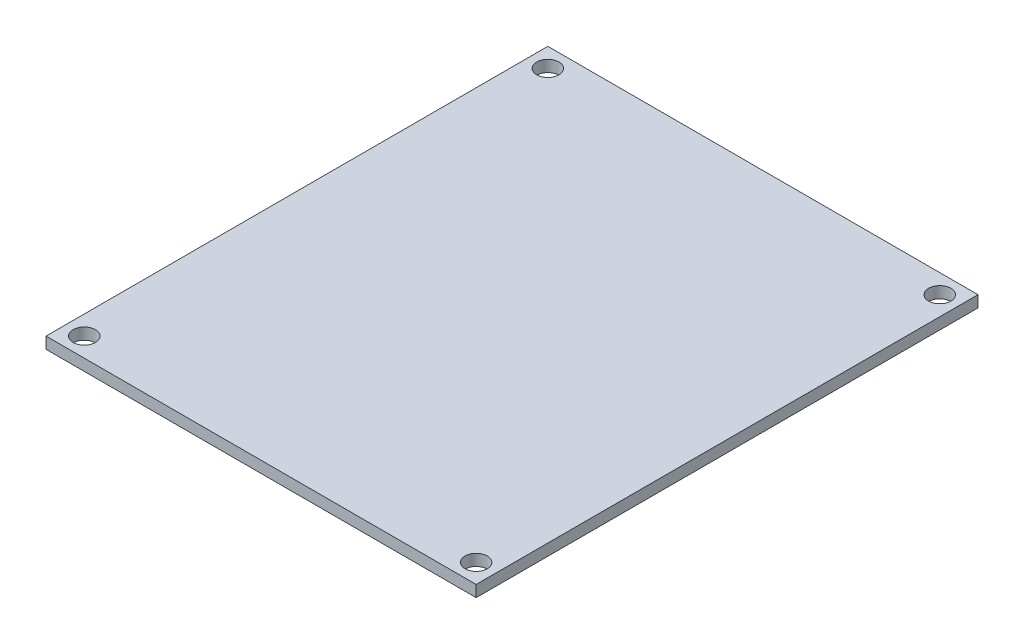
ISO-10303-21;
HEADER;
FILE_DESCRIPTION(('STEP AP214'),'2;1');
FILE_NAME('part.step','',(''),(''),'','','');
FILE_SCHEMA(('AUTOMOTIVE_DESIGN { 1 0 10303 214 1 1 1 1 }'));
ENDSEC;
DATA;
#1=APPLICATION_CONTEXT('core data for automotive mechanical design processes');
#2=APPLICATION_PROTOCOL_DEFINITION('international standard','automotive_design',2000,#1);
#3=PRODUCT_CONTEXT('',#1,'mechanical');
#4=PRODUCT('Part','Part','',(#3));
#5=PRODUCT_RELATED_PRODUCT_CATEGORY('part','',(#4));
#6=PRODUCT_DEFINITION_FORMATION('','',#4);
#7=PRODUCT_DEFINITION_CONTEXT('part definition',#1,'design');
#8=PRODUCT_DEFINITION('design','',#6,#7);
#9=PRODUCT_DEFINITION_SHAPE('','',#8);
#10=(LENGTH_UNIT() NAMED_UNIT(*) SI_UNIT(.MILLI.,.METRE.));
#11=(NAMED_UNIT(*) PLANE_ANGLE_UNIT() SI_UNIT($,.RADIAN.));
#12=(NAMED_UNIT(*) SI_UNIT($,.STERADIAN.) SOLID_ANGLE_UNIT());
#13=UNCERTAINTY_MEASURE_WITH_UNIT(LENGTH_MEASURE(1.E-05),#10,'distance_accuracy_value','');
#14=(GEOMETRIC_REPRESENTATION_CONTEXT(3) GLOBAL_UNCERTAINTY_ASSIGNED_CONTEXT((#13)) GLOBAL_UNIT_ASSIGNED_CONTEXT((#10,
#11,#12)) REPRESENTATION_CONTEXT('',''));
#15=CARTESIAN_POINT('',(0.,0.,0.));
#16=DIRECTION('',(0.,0.,1.));
#17=DIRECTION('',(1.,0.,0.));
#18=AXIS2_PLACEMENT_3D('',#15,#16,#17);
#19=CARTESIAN_POINT('',(30.,1.6,-35.));
#20=DIRECTION('',(-1.,0.,0.));
#21=DIRECTION('',(0.,0.,1.));
#22=AXIS2_PLACEMENT_3D('',#19,#20,#21);
#23=PLANE('',#22);
#24=DIRECTION('',(0.,0.,-1.));
#25=VECTOR('',#24,1.);
#26=CARTESIAN_POINT('',(30.,0.,-35.));
#27=LINE('',#26,#25);
#28=CARTESIAN_POINT('',(30.,0.,35.));
#29=VERTEX_POINT('',#28);
#30=CARTESIAN_POINT('',(30.,0.,-35.));
#31=VERTEX_POINT('',#30);
#32=EDGE_CURVE('E107',#29,#31,#27,.T.);
#33=ORIENTED_EDGE('',*,*,#32,.T.);
#34=DIRECTION('',(0.,-1.,0.));
#35=VECTOR('',#34,1.);
#36=CARTESIAN_POINT('',(30.,1.6,-35.));
#37=LINE('',#36,#35);
#38=CARTESIAN_POINT('',(30.,1.6,-35.));
#39=VERTEX_POINT('',#38);
#40=EDGE_CURVE('E11',#39,#31,#37,.T.);
#41=ORIENTED_EDGE('',*,*,#40,.F.);
#42=DIRECTION('',(0.,0.,-1.));
#43=VECTOR('',#42,1.);
#44=CARTESIAN_POINT('',(30.,1.6,-35.));
#45=LINE('',#44,#43);
#46=CARTESIAN_POINT('',(30.,1.6,35.));
#47=VERTEX_POINT('',#46);
#48=EDGE_CURVE('E91',#47,#39,#45,.T.);
#49=ORIENTED_EDGE('',*,*,#48,.F.);
#50=DIRECTION('',(0.,-1.,0.));
#51=VECTOR('',#50,1.);
#52=CARTESIAN_POINT('',(30.,1.6,35.));
#53=LINE('',#52,#51);
#54=EDGE_CURVE('E103',#47,#29,#53,.T.);
#55=ORIENTED_EDGE('',*,*,#54,.T.);
#56=EDGE_LOOP('',(#33,#41,#49,#55));
#57=FACE_BOUND('',#56,.T.);
#58=ADVANCED_FACE('F39',(#57),#23,.F.);
#59=CARTESIAN_POINT('',(-30.,1.6,-35.));
#60=DIRECTION('',(0.,0.,1.));
#61=DIRECTION('',(1.,0.,0.));
#62=AXIS2_PLACEMENT_3D('',#59,#60,#61);
#63=PLANE('',#62);
#64=DIRECTION('',(-1.,0.,0.));
#65=VECTOR('',#64,1.);
#66=CARTESIAN_POINT('',(-30.,0.,-35.));
#67=LINE('',#66,#65);
#68=CARTESIAN_POINT('',(-30.,0.,-35.));
#69=VERTEX_POINT('',#68);
#70=EDGE_CURVE('E96',#31,#69,#67,.T.);
#71=ORIENTED_EDGE('',*,*,#70,.T.);
#72=DIRECTION('',(0.,-1.,0.));
#73=VECTOR('',#72,1.);
#74=CARTESIAN_POINT('',(-30.,1.6,-35.));
#75=LINE('',#74,#73);
#76=CARTESIAN_POINT('',(-30.,1.6,-35.));
#77=VERTEX_POINT('',#76);
#78=EDGE_CURVE('E48',#77,#69,#75,.T.);
#79=ORIENTED_EDGE('',*,*,#78,.F.);
#80=DIRECTION('',(-1.,0.,0.));
#81=VECTOR('',#80,1.);
#82=CARTESIAN_POINT('',(-30.,1.6,-35.));
#83=LINE('',#82,#81);
#84=EDGE_CURVE('E86',#39,#77,#83,.T.);
#85=ORIENTED_EDGE('',*,*,#84,.F.);
#86=ORIENTED_EDGE('',*,*,#40,.T.);
#87=EDGE_LOOP('',(#71,#79,#85,#86));
#88=FACE_BOUND('',#87,.T.);
#89=ADVANCED_FACE('F95',(#88),#63,.F.);
#90=CARTESIAN_POINT('',(-30.,1.6,-35.));
#91=DIRECTION('',(1.,0.,0.));
#92=DIRECTION('',(0.,0.,-1.));
#93=AXIS2_PLACEMENT_3D('',#90,#91,#92);
#94=PLANE('',#93);
#95=DIRECTION('',(0.,0.,1.));
#96=VECTOR('',#95,1.);
#97=CARTESIAN_POINT('',(-30.,0.,-35.));
#98=LINE('',#97,#96);
#99=CARTESIAN_POINT('',(-30.,0.,35.));
#100=VERTEX_POINT('',#99);
#101=EDGE_CURVE('E73',#69,#100,#98,.T.);
#102=ORIENTED_EDGE('',*,*,#101,.T.);
#103=DIRECTION('',(0.,-1.,0.));
#104=VECTOR('',#103,1.);
#105=CARTESIAN_POINT('',(-30.,1.6,35.));
#106=LINE('',#105,#104);
#107=CARTESIAN_POINT('',(-30.,1.6,35.));
#108=VERTEX_POINT('',#107);
#109=EDGE_CURVE('E98',#108,#100,#106,.T.);
#110=ORIENTED_EDGE('',*,*,#109,.F.);
#111=DIRECTION('',(0.,0.,1.));
#112=VECTOR('',#111,1.);
#113=CARTESIAN_POINT('',(-30.,1.6,-35.));
#114=LINE('',#113,#112);
#115=EDGE_CURVE('E89',#77,#108,#114,.T.);
#116=ORIENTED_EDGE('',*,*,#115,.F.);
#117=ORIENTED_EDGE('',*,*,#78,.T.);
#118=EDGE_LOOP('',(#102,#110,#116,#117));
#119=FACE_BOUND('',#118,.T.);
#120=ADVANCED_FACE('F99',(#119),#94,.F.);
#121=CARTESIAN_POINT('',(-30.,1.6,35.));
#122=DIRECTION('',(0.,0.,-1.));
#123=DIRECTION('',(-1.,0.,0.));
#124=AXIS2_PLACEMENT_3D('',#121,#122,#123);
#125=PLANE('',#124);
#126=DIRECTION('',(1.,0.,0.));
#127=VECTOR('',#126,1.);
#128=CARTESIAN_POINT('',(-30.,0.,35.));
#129=LINE('',#128,#127);
#130=EDGE_CURVE('E79',#100,#29,#129,.T.);
#131=ORIENTED_EDGE('',*,*,#130,.T.);
#132=ORIENTED_EDGE('',*,*,#54,.F.);
#133=DIRECTION('',(1.,0.,0.));
#134=VECTOR('',#133,1.);
#135=CARTESIAN_POINT('',(-30.,1.6,35.));
#136=LINE('',#135,#134);
#137=EDGE_CURVE('E56',#108,#47,#136,.T.);
#138=ORIENTED_EDGE('',*,*,#137,.F.);
#139=ORIENTED_EDGE('',*,*,#109,.T.);
#140=EDGE_LOOP('',(#131,#132,#138,#139));
#141=FACE_BOUND('',#140,.T.);
#142=ADVANCED_FACE('F121',(#141),#125,.F.);
#143=CARTESIAN_POINT('',(0.,1.6,0.));
#144=DIRECTION('',(0.,1.,0.));
#145=DIRECTION('',(0.,0.,1.));
#146=AXIS2_PLACEMENT_3D('',#143,#144,#145);
#147=PLANE('',#146);
#148=CARTESIAN_POINT('',(-27.333,1.6,32.333));
#149=DIRECTION('',(0.,1.,0.));
#150=DIRECTION('',(0.,0.,-1.));
#151=AXIS2_PLACEMENT_3D('',#148,#149,#150);
#152=CIRCLE('',#151,1.55);
#153=CARTESIAN_POINT('',(-27.333,1.6,30.783));
#154=VERTEX_POINT('',#153);
#155=EDGE_CURVE('E136',#154,#154,#152,.T.);
#156=ORIENTED_EDGE('',*,*,#155,.F.);
#157=EDGE_LOOP('',(#156));
#158=FACE_BOUND('',#157,.T.);
#159=CARTESIAN_POINT('',(27.333,1.6,32.333));
#160=DIRECTION('',(0.,1.,0.));
#161=DIRECTION('',(0.,0.,1.));
#162=AXIS2_PLACEMENT_3D('',#159,#160,#161);
#163=CIRCLE('',#162,1.55);
#164=CARTESIAN_POINT('',(27.333,1.6,33.883));
#165=VERTEX_POINT('',#164);
#166=EDGE_CURVE('E144',#165,#165,#163,.T.);
#167=ORIENTED_EDGE('',*,*,#166,.F.);
#168=EDGE_LOOP('',(#167));
#169=FACE_BOUND('',#168,.T.);
#170=CARTESIAN_POINT('',(27.333,1.6,-32.333));
#171=DIRECTION('',(0.,1.,0.));
#172=DIRECTION('',(0.,0.,-1.));
#173=AXIS2_PLACEMENT_3D('',#170,#171,#172);
#174=CIRCLE('',#173,1.55);
#175=CARTESIAN_POINT('',(27.333,1.6,-33.883));
#176=VERTEX_POINT('',#175);
#177=EDGE_CURVE('E152',#176,#176,#174,.T.);
#178=ORIENTED_EDGE('',*,*,#177,.F.);
#179=EDGE_LOOP('',(#178));
#180=FACE_BOUND('',#179,.T.);
#181=CARTESIAN_POINT('',(-27.333,1.6,-32.333));
#182=DIRECTION('',(0.,1.,0.));
#183=DIRECTION('',(0.,0.,1.));
#184=AXIS2_PLACEMENT_3D('',#181,#182,#183);
#185=CIRCLE('',#184,1.55);
#186=CARTESIAN_POINT('',(-27.333,1.6,-30.783));
#187=VERTEX_POINT('',#186);
#188=EDGE_CURVE('E128',#187,#187,#185,.T.);
#189=ORIENTED_EDGE('',*,*,#188,.F.);
#190=EDGE_LOOP('',(#189));
#191=FACE_BOUND('',#190,.T.);
#192=ORIENTED_EDGE('',*,*,#48,.T.);
#193=ORIENTED_EDGE('',*,*,#84,.T.);
#194=ORIENTED_EDGE('',*,*,#115,.T.);
#195=ORIENTED_EDGE('',*,*,#137,.T.);
#196=EDGE_LOOP('',(#192,#193,#194,#195));
#197=FACE_BOUND('',#196,.T.);
#198=ADVANCED_FACE('F87',(#158,#169,#180,#191,#197),#147,.T.);
#199=CARTESIAN_POINT('',(0.,0.,0.));
#200=DIRECTION('',(0.,1.,0.));
#201=DIRECTION('',(0.,0.,1.));
#202=AXIS2_PLACEMENT_3D('',#199,#200,#201);
#203=PLANE('',#202);
#204=CARTESIAN_POINT('',(-27.333,0.,32.333));
#205=DIRECTION('',(0.,1.,0.));
#206=DIRECTION('',(0.,0.,-1.));
#207=AXIS2_PLACEMENT_3D('',#204,#205,#206);
#208=CIRCLE('',#207,1.55);
#209=CARTESIAN_POINT('',(-27.333,0.,30.783));
#210=VERTEX_POINT('',#209);
#211=EDGE_CURVE('E140',#210,#210,#208,.T.);
#212=ORIENTED_EDGE('',*,*,#211,.T.);
#213=EDGE_LOOP('',(#212));
#214=FACE_BOUND('',#213,.T.);
#215=CARTESIAN_POINT('',(27.333,0.,32.333));
#216=DIRECTION('',(0.,1.,0.));
#217=DIRECTION('',(0.,0.,1.));
#218=AXIS2_PLACEMENT_3D('',#215,#216,#217);
#219=CIRCLE('',#218,1.55);
#220=CARTESIAN_POINT('',(27.333,0.,33.883));
#221=VERTEX_POINT('',#220);
#222=EDGE_CURVE('E148',#221,#221,#219,.T.);
#223=ORIENTED_EDGE('',*,*,#222,.T.);
#224=EDGE_LOOP('',(#223));
#225=FACE_BOUND('',#224,.T.);
#226=CARTESIAN_POINT('',(27.333,0.,-32.333));
#227=DIRECTION('',(0.,1.,0.));
#228=DIRECTION('',(0.,0.,-1.));
#229=AXIS2_PLACEMENT_3D('',#226,#227,#228);
#230=CIRCLE('',#229,1.55);
#231=CARTESIAN_POINT('',(27.333,0.,-33.883));
#232=VERTEX_POINT('',#231);
#233=EDGE_CURVE('E132',#232,#232,#230,.T.);
#234=ORIENTED_EDGE('',*,*,#233,.T.);
#235=EDGE_LOOP('',(#234));
#236=FACE_BOUND('',#235,.T.);
#237=CARTESIAN_POINT('',(-27.333,0.,-32.333));
#238=DIRECTION('',(0.,1.,0.));
#239=DIRECTION('',(0.,0.,1.));
#240=AXIS2_PLACEMENT_3D('',#237,#238,#239);
#241=CIRCLE('',#240,1.55);
#242=CARTESIAN_POINT('',(-27.333,0.,-30.783));
#243=VERTEX_POINT('',#242);
#244=EDGE_CURVE('E111',#243,#243,#241,.T.);
#245=ORIENTED_EDGE('',*,*,#244,.T.);
#246=EDGE_LOOP('',(#245));
#247=FACE_BOUND('',#246,.T.);
#248=ORIENTED_EDGE('',*,*,#32,.F.);
#249=ORIENTED_EDGE('',*,*,#130,.F.);
#250=ORIENTED_EDGE('',*,*,#101,.F.);
#251=ORIENTED_EDGE('',*,*,#70,.F.);
#252=EDGE_LOOP('',(#248,#249,#250,#251));
#253=FACE_BOUND('',#252,.T.);
#254=ADVANCED_FACE('F124',(#214,#225,#236,#247,#253),#203,.F.);
#255=CARTESIAN_POINT('',(-27.333,0.,-32.333));
#256=DIRECTION('',(0.,1.,0.));
#257=DIRECTION('',(0.,0.,1.));
#258=AXIS2_PLACEMENT_3D('',#255,#256,#257);
#259=CYLINDRICAL_SURFACE('',#258,1.55);
#260=ORIENTED_EDGE('',*,*,#244,.F.);
#261=EDGE_LOOP('',(#260));
#262=FACE_BOUND('',#261,.T.);
#263=ORIENTED_EDGE('',*,*,#188,.T.);
#264=EDGE_LOOP('',(#263));
#265=FACE_BOUND('',#264,.T.);
#266=ADVANCED_FACE('F166',(#262,#265),#259,.F.);
#267=CARTESIAN_POINT('',(27.333,0.,-32.333));
#268=DIRECTION('',(0.,1.,0.));
#269=DIRECTION('',(0.,0.,1.));
#270=AXIS2_PLACEMENT_3D('',#267,#268,#269);
#271=CYLINDRICAL_SURFACE('',#270,1.55);
#272=ORIENTED_EDGE('',*,*,#233,.F.);
#273=EDGE_LOOP('',(#272));
#274=FACE_BOUND('',#273,.T.);
#275=ORIENTED_EDGE('',*,*,#177,.T.);
#276=EDGE_LOOP('',(#275));
#277=FACE_BOUND('',#276,.T.);
#278=ADVANCED_FACE('F162',(#274,#277),#271,.F.);
#279=CARTESIAN_POINT('',(27.333,0.,32.333));
#280=DIRECTION('',(0.,1.,0.));
#281=DIRECTION('',(0.,0.,1.));
#282=AXIS2_PLACEMENT_3D('',#279,#280,#281);
#283=CYLINDRICAL_SURFACE('',#282,1.55);
#284=ORIENTED_EDGE('',*,*,#222,.F.);
#285=EDGE_LOOP('',(#284));
#286=FACE_BOUND('',#285,.T.);
#287=ORIENTED_EDGE('',*,*,#166,.T.);
#288=EDGE_LOOP('',(#287));
#289=FACE_BOUND('',#288,.T.);
#290=ADVANCED_FACE('F165',(#286,#289),#283,.F.);
#291=CARTESIAN_POINT('',(-27.333,0.,32.333));
#292=DIRECTION('',(0.,1.,0.));
#293=DIRECTION('',(0.,0.,1.));
#294=AXIS2_PLACEMENT_3D('',#291,#292,#293);
#295=CYLINDRICAL_SURFACE('',#294,1.55);
#296=ORIENTED_EDGE('',*,*,#211,.F.);
#297=EDGE_LOOP('',(#296));
#298=FACE_BOUND('',#297,.T.);
#299=ORIENTED_EDGE('',*,*,#155,.T.);
#300=EDGE_LOOP('',(#299));
#301=FACE_BOUND('',#300,.T.);
#302=ADVANCED_FACE('F227',(#298,#301),#295,.F.);
#303=CLOSED_SHELL('',(#58,#89,#120,#142,#198,#254,#266,#278,#290,#302));
#304=MANIFOLD_SOLID_BREP('B2',#303);
#305=ADVANCED_BREP_SHAPE_REPRESENTATION('',(#18,#304),#14);
#306=SHAPE_DEFINITION_REPRESENTATION(#9,#305);
ENDSEC;
END-ISO-10303-21;
